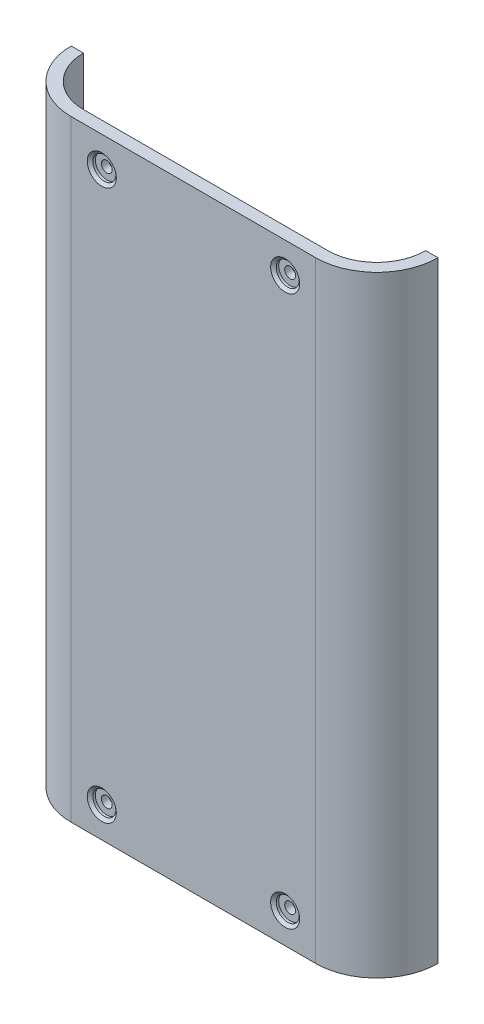
ISO-10303-21;
HEADER;
FILE_DESCRIPTION(('STEP AP214'),'2;1');
FILE_NAME('part.step','',(''),(''),'','','');
FILE_SCHEMA(('AUTOMOTIVE_DESIGN { 1 0 10303 214 1 1 1 1 }'));
ENDSEC;
DATA;
#1=APPLICATION_CONTEXT('core data for automotive mechanical design processes');
#2=APPLICATION_PROTOCOL_DEFINITION('international standard','automotive_design',2000,#1);
#3=PRODUCT_CONTEXT('',#1,'mechanical');
#4=PRODUCT('Part','Part','',(#3));
#5=PRODUCT_RELATED_PRODUCT_CATEGORY('part','',(#4));
#6=PRODUCT_DEFINITION_FORMATION('','',#4);
#7=PRODUCT_DEFINITION_CONTEXT('part definition',#1,'design');
#8=PRODUCT_DEFINITION('design','',#6,#7);
#9=PRODUCT_DEFINITION_SHAPE('','',#8);
#10=(LENGTH_UNIT() NAMED_UNIT(*) SI_UNIT(.MILLI.,.METRE.));
#11=(NAMED_UNIT(*) PLANE_ANGLE_UNIT() SI_UNIT($,.RADIAN.));
#12=(NAMED_UNIT(*) SI_UNIT($,.STERADIAN.) SOLID_ANGLE_UNIT());
#13=UNCERTAINTY_MEASURE_WITH_UNIT(LENGTH_MEASURE(1.E-05),#10,'distance_accuracy_value','');
#14=(GEOMETRIC_REPRESENTATION_CONTEXT(3) GLOBAL_UNCERTAINTY_ASSIGNED_CONTEXT((#13)) GLOBAL_UNIT_ASSIGNED_CONTEXT((#10,
#11,#12)) REPRESENTATION_CONTEXT('',''));
#15=CARTESIAN_POINT('',(0.,0.,0.));
#16=DIRECTION('',(0.,0.,1.));
#17=DIRECTION('',(1.,0.,0.));
#18=AXIS2_PLACEMENT_3D('',#15,#16,#17);
#19=CARTESIAN_POINT('',(0.,254.,25.3999999999999));
#20=DIRECTION('',(0.,0.,-1.));
#21=DIRECTION('',(-1.,0.,0.));
#22=AXIS2_PLACEMENT_3D('',#19,#20,#21);
#23=PLANE('',#22);
#24=DIRECTION('',(0.,-1.,0.));
#25=VECTOR('',#24,1.);
#26=CARTESIAN_POINT('',(-35.56,114.3,25.3999999999999));
#27=LINE('',#26,#25);
#28=CARTESIAN_POINT('',(-35.56,127.,25.3999999999999));
#29=VERTEX_POINT('',#28);
#30=CARTESIAN_POINT('',(-35.56,0.,25.3999999999999));
#31=VERTEX_POINT('',#30);
#32=EDGE_CURVE('E203',#29,#31,#27,.T.);
#33=ORIENTED_EDGE('',*,*,#32,.T.);
#34=DIRECTION('',(1.,0.,0.));
#35=VECTOR('',#34,1.);
#36=CARTESIAN_POINT('',(0.,0.,25.3999999999999));
#37=LINE('',#36,#35);
#38=CARTESIAN_POINT('',(-38.1,0.,25.4));
#39=VERTEX_POINT('',#38);
#40=EDGE_CURVE('E228',#39,#31,#37,.T.);
#41=ORIENTED_EDGE('',*,*,#40,.F.);
#42=DIRECTION('',(0.,-1.,0.));
#43=VECTOR('',#42,1.);
#44=CARTESIAN_POINT('',(-38.1,127.,25.4));
#45=LINE('',#44,#43);
#46=CARTESIAN_POINT('',(-38.1,127.,25.3999999999999));
#47=VERTEX_POINT('',#46);
#48=EDGE_CURVE('E12',#39,#47,#45,.F.);
#49=ORIENTED_EDGE('',*,*,#48,.T.);
#50=DIRECTION('',(-1.,0.,0.));
#51=VECTOR('',#50,1.);
#52=CARTESIAN_POINT('',(0.,127.,25.3999999999999));
#53=LINE('',#52,#51);
#54=EDGE_CURVE('E222',#29,#47,#53,.T.);
#55=ORIENTED_EDGE('',*,*,#54,.F.);
#56=EDGE_LOOP('',(#33,#41,#49,#55));
#57=FACE_BOUND('',#56,.T.);
#58=ADVANCED_FACE('F123',(#57),#23,.T.);
#59=CARTESIAN_POINT('',(25.4,114.3,25.4));
#60=DIRECTION('',(0.,-1.,0.));
#61=DIRECTION('',(0.,0.,-1.));
#62=AXIS2_PLACEMENT_3D('',#59,#60,#61);
#63=CYLINDRICAL_SURFACE('',#62,10.16);
#64=DIRECTION('',(0.,-1.,0.));
#65=VECTOR('',#64,1.);
#66=CARTESIAN_POINT('',(35.56,114.3,25.4));
#67=LINE('',#66,#65);
#68=CARTESIAN_POINT('',(35.56,127.,25.4));
#69=VERTEX_POINT('',#68);
#70=CARTESIAN_POINT('',(35.56,0.,25.4));
#71=VERTEX_POINT('',#70);
#72=EDGE_CURVE('E191',#69,#71,#67,.T.);
#73=ORIENTED_EDGE('',*,*,#72,.T.);
#74=CARTESIAN_POINT('',(25.4,0.,25.4));
#75=DIRECTION('',(0.,-1.,0.));
#76=DIRECTION('',(0.,0.,-1.));
#77=AXIS2_PLACEMENT_3D('',#74,#75,#76);
#78=CIRCLE('',#77,10.16);
#79=CARTESIAN_POINT('',(25.4,0.,35.56));
#80=VERTEX_POINT('',#79);
#81=EDGE_CURVE('E258',#71,#80,#78,.T.);
#82=ORIENTED_EDGE('',*,*,#81,.T.);
#83=DIRECTION('',(0.,-1.,0.));
#84=VECTOR('',#83,1.);
#85=CARTESIAN_POINT('',(25.4,124.46,35.56));
#86=LINE('',#85,#84);
#87=CARTESIAN_POINT('',(25.4,127.,35.56));
#88=VERTEX_POINT('',#87);
#89=EDGE_CURVE('E209',#88,#80,#86,.T.);
#90=ORIENTED_EDGE('',*,*,#89,.F.);
#91=CARTESIAN_POINT('',(25.4,127.,25.4));
#92=DIRECTION('',(0.,-1.,0.));
#93=DIRECTION('',(0.,0.,-1.));
#94=AXIS2_PLACEMENT_3D('',#91,#92,#93);
#95=CIRCLE('',#94,10.16);
#96=EDGE_CURVE('E207',#69,#88,#95,.T.);
#97=ORIENTED_EDGE('',*,*,#96,.F.);
#98=EDGE_LOOP('',(#73,#82,#90,#97));
#99=FACE_BOUND('',#98,.T.);
#100=ADVANCED_FACE('F208',(#99),#63,.F.);
#101=CARTESIAN_POINT('',(-25.4,114.3,25.4));
#102=DIRECTION('',(0.,-1.,0.));
#103=DIRECTION('',(0.,0.,-1.));
#104=AXIS2_PLACEMENT_3D('',#101,#102,#103);
#105=CYLINDRICAL_SURFACE('',#104,10.16);
#106=DIRECTION('',(0.,-1.,0.));
#107=VECTOR('',#106,1.);
#108=CARTESIAN_POINT('',(-25.4,124.46,35.56));
#109=LINE('',#108,#107);
#110=CARTESIAN_POINT('',(-25.4,127.,35.56));
#111=VERTEX_POINT('',#110);
#112=CARTESIAN_POINT('',(-25.4,0.,35.56));
#113=VERTEX_POINT('',#112);
#114=EDGE_CURVE('E327',#111,#113,#109,.T.);
#115=ORIENTED_EDGE('',*,*,#114,.T.);
#116=CARTESIAN_POINT('',(-25.4,0.,25.4));
#117=DIRECTION('',(0.,-1.,0.));
#118=DIRECTION('',(0.,0.,-1.));
#119=AXIS2_PLACEMENT_3D('',#116,#117,#118);
#120=CIRCLE('',#119,10.16);
#121=EDGE_CURVE('E214',#113,#31,#120,.T.);
#122=ORIENTED_EDGE('',*,*,#121,.T.);
#123=ORIENTED_EDGE('',*,*,#32,.F.);
#124=CARTESIAN_POINT('',(-25.4,127.,25.4));
#125=DIRECTION('',(0.,-1.,0.));
#126=DIRECTION('',(0.,0.,-1.));
#127=AXIS2_PLACEMENT_3D('',#124,#125,#126);
#128=CIRCLE('',#127,10.16);
#129=EDGE_CURVE('E204',#111,#29,#128,.T.);
#130=ORIENTED_EDGE('',*,*,#129,.F.);
#131=EDGE_LOOP('',(#115,#122,#123,#130));
#132=FACE_BOUND('',#131,.T.);
#133=ADVANCED_FACE('F338',(#132),#105,.F.);
#134=CARTESIAN_POINT('',(0.,127.,0.));
#135=DIRECTION('',(0.,1.,0.));
#136=DIRECTION('',(0.,0.,1.));
#137=AXIS2_PLACEMENT_3D('',#134,#135,#136);
#138=PLANE('',#137);
#139=ORIENTED_EDGE('',*,*,#129,.T.);
#140=ORIENTED_EDGE('',*,*,#54,.T.);
#141=CARTESIAN_POINT('',(-25.4,127.,25.4));
#142=DIRECTION('',(0.,1.,0.));
#143=DIRECTION('',(0.,0.,1.));
#144=AXIS2_PLACEMENT_3D('',#141,#142,#143);
#145=CIRCLE('',#144,12.7);
#146=CARTESIAN_POINT('',(-25.4,127.,38.1));
#147=VERTEX_POINT('',#146);
#148=EDGE_CURVE('E148',#47,#147,#145,.T.);
#149=ORIENTED_EDGE('',*,*,#148,.T.);
#150=DIRECTION('',(1.,0.,0.));
#151=VECTOR('',#150,1.);
#152=CARTESIAN_POINT('',(-38.1,127.,38.1));
#153=LINE('',#152,#151);
#154=CARTESIAN_POINT('',(25.4,127.,38.1));
#155=VERTEX_POINT('',#154);
#156=EDGE_CURVE('E226',#147,#155,#153,.T.);
#157=ORIENTED_EDGE('',*,*,#156,.T.);
#158=CARTESIAN_POINT('',(25.4,127.,25.4));
#159=DIRECTION('',(0.,1.,0.));
#160=DIRECTION('',(0.,0.,1.));
#161=AXIS2_PLACEMENT_3D('',#158,#159,#160);
#162=CIRCLE('',#161,12.7);
#163=CARTESIAN_POINT('',(38.1,127.,25.4));
#164=VERTEX_POINT('',#163);
#165=EDGE_CURVE('E133',#155,#164,#162,.T.);
#166=ORIENTED_EDGE('',*,*,#165,.T.);
#167=EDGE_CURVE('E196',#164,#69,#53,.T.);
#168=ORIENTED_EDGE('',*,*,#167,.T.);
#169=ORIENTED_EDGE('',*,*,#96,.T.);
#170=DIRECTION('',(1.,0.,0.));
#171=VECTOR('',#170,1.);
#172=CARTESIAN_POINT('',(0.,127.,35.56));
#173=LINE('',#172,#171);
#174=EDGE_CURVE('E213',#111,#88,#173,.T.);
#175=ORIENTED_EDGE('',*,*,#174,.F.);
#176=EDGE_LOOP('',(#139,#140,#149,#157,#166,#168,#169,#175));
#177=FACE_BOUND('',#176,.T.);
#178=ADVANCED_FACE('F217',(#177),#138,.T.);
#179=CARTESIAN_POINT('',(0.,0.,0.));
#180=DIRECTION('',(0.,1.,0.));
#181=DIRECTION('',(0.,0.,1.));
#182=AXIS2_PLACEMENT_3D('',#179,#180,#181);
#183=PLANE('',#182);
#184=ORIENTED_EDGE('',*,*,#40,.T.);
#185=ORIENTED_EDGE('',*,*,#121,.F.);
#186=DIRECTION('',(1.,0.,0.));
#187=VECTOR('',#186,1.);
#188=CARTESIAN_POINT('',(0.,0.,35.56));
#189=LINE('',#188,#187);
#190=EDGE_CURVE('E322',#113,#80,#189,.T.);
#191=ORIENTED_EDGE('',*,*,#190,.T.);
#192=ORIENTED_EDGE('',*,*,#81,.F.);
#193=CARTESIAN_POINT('',(38.1,0.,25.4));
#194=VERTEX_POINT('',#193);
#195=EDGE_CURVE('E198',#71,#194,#37,.T.);
#196=ORIENTED_EDGE('',*,*,#195,.T.);
#197=CARTESIAN_POINT('',(25.4,0.,25.4));
#198=DIRECTION('',(0.,1.,0.));
#199=DIRECTION('',(0.,0.,1.));
#200=AXIS2_PLACEMENT_3D('',#197,#198,#199);
#201=CIRCLE('',#200,12.7);
#202=CARTESIAN_POINT('',(25.4,0.,38.1));
#203=VERTEX_POINT('',#202);
#204=EDGE_CURVE('E241',#194,#203,#201,.F.);
#205=ORIENTED_EDGE('',*,*,#204,.T.);
#206=DIRECTION('',(1.,0.,0.));
#207=VECTOR('',#206,1.);
#208=CARTESIAN_POINT('',(-38.1,0.,38.1));
#209=LINE('',#208,#207);
#210=CARTESIAN_POINT('',(-25.4,0.,38.1));
#211=VERTEX_POINT('',#210);
#212=EDGE_CURVE('E221',#211,#203,#209,.T.);
#213=ORIENTED_EDGE('',*,*,#212,.F.);
#214=CARTESIAN_POINT('',(-25.4,0.,25.4));
#215=DIRECTION('',(0.,1.,0.));
#216=DIRECTION('',(0.,0.,1.));
#217=AXIS2_PLACEMENT_3D('',#214,#215,#216);
#218=CIRCLE('',#217,12.7);
#219=EDGE_CURVE('E237',#211,#39,#218,.F.);
#220=ORIENTED_EDGE('',*,*,#219,.T.);
#221=EDGE_LOOP('',(#184,#185,#191,#192,#196,#205,#213,#220));
#222=FACE_BOUND('',#221,.T.);
#223=ADVANCED_FACE('F336',(#222),#183,.F.);
#224=CARTESIAN_POINT('',(-38.1,127.,38.1));
#225=DIRECTION('',(0.,0.,-1.));
#226=DIRECTION('',(-1.,0.,0.));
#227=AXIS2_PLACEMENT_3D('',#224,#225,#226);
#228=PLANE('',#227);
#229=CARTESIAN_POINT('',(-19.05,120.65,38.1));
#230=DIRECTION('',(0.,0.,1.));
#231=DIRECTION('',(1.,0.,0.));
#232=AXIS2_PLACEMENT_3D('',#229,#230,#231);
#233=CIRCLE('',#232,3.01625);
#234=CARTESIAN_POINT('',(-16.03375,120.65,38.1));
#235=VERTEX_POINT('',#234);
#236=EDGE_CURVE('E448',#235,#235,#233,.T.);
#237=ORIENTED_EDGE('',*,*,#236,.F.);
#238=EDGE_LOOP('',(#237));
#239=FACE_BOUND('',#238,.T.);
#240=CARTESIAN_POINT('',(19.05,120.65,38.1));
#241=DIRECTION('',(0.,0.,1.));
#242=DIRECTION('',(1.,0.,0.));
#243=AXIS2_PLACEMENT_3D('',#240,#241,#242);
#244=CIRCLE('',#243,3.01625);
#245=CARTESIAN_POINT('',(22.06625,120.65,38.1));
#246=VERTEX_POINT('',#245);
#247=EDGE_CURVE('E462',#246,#246,#244,.T.);
#248=ORIENTED_EDGE('',*,*,#247,.F.);
#249=EDGE_LOOP('',(#248));
#250=FACE_BOUND('',#249,.T.);
#251=CARTESIAN_POINT('',(-19.05,6.35,38.1));
#252=DIRECTION('',(0.,0.,1.));
#253=DIRECTION('',(1.,0.,0.));
#254=AXIS2_PLACEMENT_3D('',#251,#252,#253);
#255=CIRCLE('',#254,3.01625);
#256=CARTESIAN_POINT('',(-16.03375,6.35,38.1));
#257=VERTEX_POINT('',#256);
#258=EDGE_CURVE('E268',#257,#257,#255,.T.);
#259=ORIENTED_EDGE('',*,*,#258,.F.);
#260=EDGE_LOOP('',(#259));
#261=FACE_BOUND('',#260,.T.);
#262=CARTESIAN_POINT('',(19.05,6.35,38.1));
#263=DIRECTION('',(0.,0.,1.));
#264=DIRECTION('',(1.,0.,0.));
#265=AXIS2_PLACEMENT_3D('',#262,#263,#264);
#266=CIRCLE('',#265,3.01625);
#267=CARTESIAN_POINT('',(22.06625,6.35,38.1));
#268=VERTEX_POINT('',#267);
#269=EDGE_CURVE('E263',#268,#268,#266,.T.);
#270=ORIENTED_EDGE('',*,*,#269,.F.);
#271=EDGE_LOOP('',(#270));
#272=FACE_BOUND('',#271,.T.);
#273=ORIENTED_EDGE('',*,*,#212,.T.);
#274=DIRECTION('',(0.,-1.,0.));
#275=VECTOR('',#274,1.);
#276=CARTESIAN_POINT('',(25.4,127.,38.1));
#277=LINE('',#276,#275);
#278=EDGE_CURVE('E141',#203,#155,#277,.F.);
#279=ORIENTED_EDGE('',*,*,#278,.T.);
#280=ORIENTED_EDGE('',*,*,#156,.F.);
#281=DIRECTION('',(0.,-1.,0.));
#282=VECTOR('',#281,1.);
#283=CARTESIAN_POINT('',(-25.4,127.,38.1));
#284=LINE('',#283,#282);
#285=EDGE_CURVE('E244',#147,#211,#284,.T.);
#286=ORIENTED_EDGE('',*,*,#285,.T.);
#287=EDGE_LOOP('',(#273,#279,#280,#286));
#288=FACE_BOUND('',#287,.T.);
#289=ADVANCED_FACE('F346',(#239,#250,#261,#272,#288),#228,.F.);
#290=CARTESIAN_POINT('',(25.4,127.,25.4));
#291=DIRECTION('',(0.,-1.,0.));
#292=DIRECTION('',(0.,0.,-1.));
#293=AXIS2_PLACEMENT_3D('',#290,#291,#292);
#294=CYLINDRICAL_SURFACE('',#293,12.7);
#295=ORIENTED_EDGE('',*,*,#165,.F.);
#296=ORIENTED_EDGE('',*,*,#278,.F.);
#297=ORIENTED_EDGE('',*,*,#204,.F.);
#298=DIRECTION('',(0.,-1.,0.));
#299=VECTOR('',#298,1.);
#300=CARTESIAN_POINT('',(38.1,127.,25.4));
#301=LINE('',#300,#299);
#302=EDGE_CURVE('E233',#164,#194,#301,.T.);
#303=ORIENTED_EDGE('',*,*,#302,.F.);
#304=EDGE_LOOP('',(#295,#296,#297,#303));
#305=FACE_BOUND('',#304,.T.);
#306=ADVANCED_FACE('F349',(#305),#294,.T.);
#307=CARTESIAN_POINT('',(-25.4,127.,25.4));
#308=DIRECTION('',(0.,-1.,0.));
#309=DIRECTION('',(0.,0.,-1.));
#310=AXIS2_PLACEMENT_3D('',#307,#308,#309);
#311=CYLINDRICAL_SURFACE('',#310,12.7);
#312=ORIENTED_EDGE('',*,*,#148,.F.);
#313=ORIENTED_EDGE('',*,*,#48,.F.);
#314=ORIENTED_EDGE('',*,*,#219,.F.);
#315=ORIENTED_EDGE('',*,*,#285,.F.);
#316=EDGE_LOOP('',(#312,#313,#314,#315));
#317=FACE_BOUND('',#316,.T.);
#318=ADVANCED_FACE('F125',(#317),#311,.T.);
#319=ORIENTED_EDGE('',*,*,#72,.F.);
#320=ORIENTED_EDGE('',*,*,#167,.F.);
#321=ORIENTED_EDGE('',*,*,#302,.T.);
#322=ORIENTED_EDGE('',*,*,#195,.F.);
#323=EDGE_LOOP('',(#319,#320,#321,#322));
#324=FACE_BOUND('',#323,.T.);
#325=ADVANCED_FACE('F193',(#324),#23,.T.);
#326=CARTESIAN_POINT('',(0.,124.46,35.56));
#327=DIRECTION('',(0.,0.,-1.));
#328=DIRECTION('',(-1.,0.,0.));
#329=AXIS2_PLACEMENT_3D('',#326,#327,#328);
#330=PLANE('',#329);
#331=CARTESIAN_POINT('',(-19.05,120.65,35.56));
#332=DIRECTION('',(0.,0.,-1.));
#333=DIRECTION('',(-1.,0.,0.));
#334=AXIS2_PLACEMENT_3D('',#331,#332,#333);
#335=CIRCLE('',#334,1.1303);
#336=CARTESIAN_POINT('',(-20.1803,120.65,35.56));
#337=VERTEX_POINT('',#336);
#338=EDGE_CURVE('E127',#337,#337,#335,.T.);
#339=ORIENTED_EDGE('',*,*,#338,.F.);
#340=EDGE_LOOP('',(#339));
#341=FACE_BOUND('',#340,.T.);
#342=CARTESIAN_POINT('',(19.05,120.65,35.56));
#343=DIRECTION('',(0.,0.,-1.));
#344=DIRECTION('',(-1.,0.,0.));
#345=AXIS2_PLACEMENT_3D('',#342,#343,#344);
#346=CIRCLE('',#345,1.1303);
#347=CARTESIAN_POINT('',(17.9197,120.65,35.56));
#348=VERTEX_POINT('',#347);
#349=EDGE_CURVE('E265',#348,#348,#346,.T.);
#350=ORIENTED_EDGE('',*,*,#349,.F.);
#351=EDGE_LOOP('',(#350));
#352=FACE_BOUND('',#351,.T.);
#353=CARTESIAN_POINT('',(-19.05,6.35,35.56));
#354=DIRECTION('',(0.,0.,-1.));
#355=DIRECTION('',(-1.,0.,0.));
#356=AXIS2_PLACEMENT_3D('',#353,#354,#355);
#357=CIRCLE('',#356,1.1303);
#358=CARTESIAN_POINT('',(-20.1803,6.35,35.56));
#359=VERTEX_POINT('',#358);
#360=EDGE_CURVE('E260',#359,#359,#357,.T.);
#361=ORIENTED_EDGE('',*,*,#360,.F.);
#362=EDGE_LOOP('',(#361));
#363=FACE_BOUND('',#362,.T.);
#364=CARTESIAN_POINT('',(19.05,6.35,35.56));
#365=DIRECTION('',(0.,0.,-1.));
#366=DIRECTION('',(-1.,0.,0.));
#367=AXIS2_PLACEMENT_3D('',#364,#365,#366);
#368=CIRCLE('',#367,1.1303);
#369=CARTESIAN_POINT('',(17.9197,6.35,35.56));
#370=VERTEX_POINT('',#369);
#371=EDGE_CURVE('E254',#370,#370,#368,.T.);
#372=ORIENTED_EDGE('',*,*,#371,.F.);
#373=EDGE_LOOP('',(#372));
#374=FACE_BOUND('',#373,.T.);
#375=ORIENTED_EDGE('',*,*,#190,.F.);
#376=ORIENTED_EDGE('',*,*,#114,.F.);
#377=ORIENTED_EDGE('',*,*,#174,.T.);
#378=ORIENTED_EDGE('',*,*,#89,.T.);
#379=EDGE_LOOP('',(#375,#376,#377,#378));
#380=FACE_BOUND('',#379,.T.);
#381=ADVANCED_FACE('F332',(#341,#352,#363,#374,#380),#330,.T.);
#382=CARTESIAN_POINT('',(19.05,6.35,38.1));
#383=DIRECTION('',(0.,0.,1.));
#384=DIRECTION('',(1.,0.,0.));
#385=AXIS2_PLACEMENT_3D('',#382,#383,#384);
#386=CYLINDRICAL_SURFACE('',#385,1.1303);
#387=ORIENTED_EDGE('',*,*,#371,.T.);
#388=EDGE_LOOP('',(#387));
#389=FACE_BOUND('',#388,.T.);
#390=CARTESIAN_POINT('',(19.05,6.35,37.0586));
#391=DIRECTION('',(0.,0.,1.));
#392=DIRECTION('',(1.,0.,0.));
#393=AXIS2_PLACEMENT_3D('',#390,#391,#392);
#394=CIRCLE('',#393,1.1303);
#395=CARTESIAN_POINT('',(20.1803,6.35,37.0586));
#396=VERTEX_POINT('',#395);
#397=EDGE_CURVE('E259',#396,#396,#394,.T.);
#398=ORIENTED_EDGE('',*,*,#397,.T.);
#399=EDGE_LOOP('',(#398));
#400=FACE_BOUND('',#399,.T.);
#401=ADVANCED_FACE('F370',(#389,#400),#386,.F.);
#402=CARTESIAN_POINT('',(20.1803,6.35,37.0586));
#403=DIRECTION('',(0.,0.,-1.));
#404=DIRECTION('',(-1.,0.,0.));
#405=AXIS2_PLACEMENT_3D('',#402,#403,#404);
#406=PLANE('',#405);
#407=ORIENTED_EDGE('',*,*,#397,.F.);
#408=EDGE_LOOP('',(#407));
#409=FACE_BOUND('',#408,.T.);
#410=CARTESIAN_POINT('',(19.05,6.35,37.0586));
#411=DIRECTION('',(0.,0.,1.));
#412=DIRECTION('',(1.,0.,0.));
#413=AXIS2_PLACEMENT_3D('',#410,#411,#412);
#414=CIRCLE('',#413,2.38125);
#415=CARTESIAN_POINT('',(21.43125,6.35,37.0586));
#416=VERTEX_POINT('',#415);
#417=EDGE_CURVE('E305',#416,#416,#414,.T.);
#418=ORIENTED_EDGE('',*,*,#417,.T.);
#419=EDGE_LOOP('',(#418));
#420=FACE_BOUND('',#419,.T.);
#421=ADVANCED_FACE('F375',(#409,#420),#406,.F.);
#422=CARTESIAN_POINT('',(19.05,6.35,38.1));
#423=DIRECTION('',(0.,0.,1.));
#424=DIRECTION('',(1.,0.,0.));
#425=AXIS2_PLACEMENT_3D('',#422,#423,#424);
#426=CYLINDRICAL_SURFACE('',#425,2.38125);
#427=ORIENTED_EDGE('',*,*,#417,.F.);
#428=EDGE_LOOP('',(#427));
#429=FACE_BOUND('',#428,.T.);
#430=CARTESIAN_POINT('',(19.05,6.35,37.5671717342024));
#431=DIRECTION('',(0.,0.,1.));
#432=DIRECTION('',(1.,0.,0.));
#433=AXIS2_PLACEMENT_3D('',#430,#431,#432);
#434=CIRCLE('',#433,2.38125);
#435=CARTESIAN_POINT('',(21.43125,6.35,37.5671717342024));
#436=VERTEX_POINT('',#435);
#437=EDGE_CURVE('E301',#436,#436,#434,.T.);
#438=ORIENTED_EDGE('',*,*,#437,.T.);
#439=EDGE_LOOP('',(#438));
#440=FACE_BOUND('',#439,.T.);
#441=ADVANCED_FACE('F385',(#429,#440),#426,.F.);
#442=CARTESIAN_POINT('',(19.05,6.35,38.1));
#443=DIRECTION('',(0.,0.,1.));
#444=DIRECTION('',(1.,0.,0.));
#445=AXIS2_PLACEMENT_3D('',#442,#443,#444);
#446=CONICAL_SURFACE('',#445,3.01625,0.872664625997164);
#447=ORIENTED_EDGE('',*,*,#437,.F.);
#448=EDGE_LOOP('',(#447));
#449=FACE_BOUND('',#448,.T.);
#450=ORIENTED_EDGE('',*,*,#269,.T.);
#451=EDGE_LOOP('',(#450));
#452=FACE_BOUND('',#451,.T.);
#453=ADVANCED_FACE('F389',(#449,#452),#446,.F.);
#454=CARTESIAN_POINT('',(-19.05,6.35,38.1));
#455=DIRECTION('',(0.,0.,1.));
#456=DIRECTION('',(1.,0.,0.));
#457=AXIS2_PLACEMENT_3D('',#454,#455,#456);
#458=CYLINDRICAL_SURFACE('',#457,1.1303);
#459=ORIENTED_EDGE('',*,*,#360,.T.);
#460=EDGE_LOOP('',(#459));
#461=FACE_BOUND('',#460,.T.);
#462=CARTESIAN_POINT('',(-19.05,6.35,37.0586));
#463=DIRECTION('',(0.,0.,1.));
#464=DIRECTION('',(1.,0.,0.));
#465=AXIS2_PLACEMENT_3D('',#462,#463,#464);
#466=CIRCLE('',#465,1.1303);
#467=CARTESIAN_POINT('',(-17.9197,6.35,37.0586));
#468=VERTEX_POINT('',#467);
#469=EDGE_CURVE('E264',#468,#468,#466,.T.);
#470=ORIENTED_EDGE('',*,*,#469,.T.);
#471=EDGE_LOOP('',(#470));
#472=FACE_BOUND('',#471,.T.);
#473=ADVANCED_FACE('F393',(#461,#472),#458,.F.);
#474=CARTESIAN_POINT('',(-17.9197,6.35,37.0586));
#475=DIRECTION('',(0.,0.,-1.));
#476=DIRECTION('',(-1.,0.,0.));
#477=AXIS2_PLACEMENT_3D('',#474,#475,#476);
#478=PLANE('',#477);
#479=ORIENTED_EDGE('',*,*,#469,.F.);
#480=EDGE_LOOP('',(#479));
#481=FACE_BOUND('',#480,.T.);
#482=CARTESIAN_POINT('',(-19.05,6.35,37.0586));
#483=DIRECTION('',(0.,0.,1.));
#484=DIRECTION('',(1.,0.,0.));
#485=AXIS2_PLACEMENT_3D('',#482,#483,#484);
#486=CIRCLE('',#485,2.38125);
#487=CARTESIAN_POINT('',(-16.66875,6.35,37.0586));
#488=VERTEX_POINT('',#487);
#489=EDGE_CURVE('E291',#488,#488,#486,.T.);
#490=ORIENTED_EDGE('',*,*,#489,.T.);
#491=EDGE_LOOP('',(#490));
#492=FACE_BOUND('',#491,.T.);
#493=ADVANCED_FACE('F397',(#481,#492),#478,.F.);
#494=CARTESIAN_POINT('',(-19.05,6.35,38.1));
#495=DIRECTION('',(0.,0.,1.));
#496=DIRECTION('',(1.,0.,0.));
#497=AXIS2_PLACEMENT_3D('',#494,#495,#496);
#498=CYLINDRICAL_SURFACE('',#497,2.38125);
#499=ORIENTED_EDGE('',*,*,#489,.F.);
#500=EDGE_LOOP('',(#499));
#501=FACE_BOUND('',#500,.T.);
#502=CARTESIAN_POINT('',(-19.05,6.35,37.5671717342024));
#503=DIRECTION('',(0.,0.,1.));
#504=DIRECTION('',(1.,0.,0.));
#505=AXIS2_PLACEMENT_3D('',#502,#503,#504);
#506=CIRCLE('',#505,2.38125);
#507=CARTESIAN_POINT('',(-16.66875,6.35,37.5671717342024));
#508=VERTEX_POINT('',#507);
#509=EDGE_CURVE('E275',#508,#508,#506,.T.);
#510=ORIENTED_EDGE('',*,*,#509,.T.);
#511=EDGE_LOOP('',(#510));
#512=FACE_BOUND('',#511,.T.);
#513=ADVANCED_FACE('F401',(#501,#512),#498,.F.);
#514=CARTESIAN_POINT('',(-19.05,6.35,38.1));
#515=DIRECTION('',(0.,0.,1.));
#516=DIRECTION('',(1.,0.,0.));
#517=AXIS2_PLACEMENT_3D('',#514,#515,#516);
#518=CONICAL_SURFACE('',#517,3.01625,0.872664625997164);
#519=ORIENTED_EDGE('',*,*,#509,.F.);
#520=EDGE_LOOP('',(#519));
#521=FACE_BOUND('',#520,.T.);
#522=ORIENTED_EDGE('',*,*,#258,.T.);
#523=EDGE_LOOP('',(#522));
#524=FACE_BOUND('',#523,.T.);
#525=ADVANCED_FACE('F405',(#521,#524),#518,.F.);
#526=CARTESIAN_POINT('',(19.05,120.65,38.1));
#527=DIRECTION('',(0.,0.,1.));
#528=DIRECTION('',(1.,0.,0.));
#529=AXIS2_PLACEMENT_3D('',#526,#527,#528);
#530=CYLINDRICAL_SURFACE('',#529,1.1303);
#531=ORIENTED_EDGE('',*,*,#349,.T.);
#532=EDGE_LOOP('',(#531));
#533=FACE_BOUND('',#532,.T.);
#534=CARTESIAN_POINT('',(19.05,120.65,37.0586));
#535=DIRECTION('',(0.,0.,1.));
#536=DIRECTION('',(1.,0.,0.));
#537=AXIS2_PLACEMENT_3D('',#534,#535,#536);
#538=CIRCLE('',#537,1.1303);
#539=CARTESIAN_POINT('',(20.1803,120.65,37.0586));
#540=VERTEX_POINT('',#539);
#541=EDGE_CURVE('E269',#540,#540,#538,.T.);
#542=ORIENTED_EDGE('',*,*,#541,.T.);
#543=EDGE_LOOP('',(#542));
#544=FACE_BOUND('',#543,.T.);
#545=ADVANCED_FACE('F409',(#533,#544),#530,.F.);
#546=CARTESIAN_POINT('',(20.1803,120.65,37.0586));
#547=DIRECTION('',(0.,0.,-1.));
#548=DIRECTION('',(-1.,0.,0.));
#549=AXIS2_PLACEMENT_3D('',#546,#547,#548);
#550=PLANE('',#549);
#551=ORIENTED_EDGE('',*,*,#541,.F.);
#552=EDGE_LOOP('',(#551));
#553=FACE_BOUND('',#552,.T.);
#554=CARTESIAN_POINT('',(19.05,120.65,37.0586));
#555=DIRECTION('',(0.,0.,1.));
#556=DIRECTION('',(1.,0.,0.));
#557=AXIS2_PLACEMENT_3D('',#554,#555,#556);
#558=CIRCLE('',#557,2.38125);
#559=CARTESIAN_POINT('',(21.43125,120.65,37.0586));
#560=VERTEX_POINT('',#559);
#561=EDGE_CURVE('E278',#560,#560,#558,.T.);
#562=ORIENTED_EDGE('',*,*,#561,.T.);
#563=EDGE_LOOP('',(#562));
#564=FACE_BOUND('',#563,.T.);
#565=ADVANCED_FACE('F413',(#553,#564),#550,.F.);
#566=CARTESIAN_POINT('',(19.05,120.65,38.1));
#567=DIRECTION('',(0.,0.,1.));
#568=DIRECTION('',(1.,0.,0.));
#569=AXIS2_PLACEMENT_3D('',#566,#567,#568);
#570=CYLINDRICAL_SURFACE('',#569,2.38125);
#571=ORIENTED_EDGE('',*,*,#561,.F.);
#572=EDGE_LOOP('',(#571));
#573=FACE_BOUND('',#572,.T.);
#574=CARTESIAN_POINT('',(19.05,120.65,37.5671717342024));
#575=DIRECTION('',(0.,0.,1.));
#576=DIRECTION('',(1.,0.,0.));
#577=AXIS2_PLACEMENT_3D('',#574,#575,#576);
#578=CIRCLE('',#577,2.38125);
#579=CARTESIAN_POINT('',(21.43125,120.65,37.5671717342024));
#580=VERTEX_POINT('',#579);
#581=EDGE_CURVE('E284',#580,#580,#578,.T.);
#582=ORIENTED_EDGE('',*,*,#581,.T.);
#583=EDGE_LOOP('',(#582));
#584=FACE_BOUND('',#583,.T.);
#585=ADVANCED_FACE('F416',(#573,#584),#570,.F.);
#586=CARTESIAN_POINT('',(19.05,120.65,38.1));
#587=DIRECTION('',(0.,0.,1.));
#588=DIRECTION('',(1.,0.,0.));
#589=AXIS2_PLACEMENT_3D('',#586,#587,#588);
#590=CONICAL_SURFACE('',#589,3.01625,0.872664625997164);
#591=ORIENTED_EDGE('',*,*,#581,.F.);
#592=EDGE_LOOP('',(#591));
#593=FACE_BOUND('',#592,.T.);
#594=ORIENTED_EDGE('',*,*,#247,.T.);
#595=EDGE_LOOP('',(#594));
#596=FACE_BOUND('',#595,.T.);
#597=ADVANCED_FACE('F420',(#593,#596),#590,.F.);
#598=CARTESIAN_POINT('',(-19.05,120.65,38.1));
#599=DIRECTION('',(0.,0.,1.));
#600=DIRECTION('',(1.,0.,0.));
#601=AXIS2_PLACEMENT_3D('',#598,#599,#600);
#602=CYLINDRICAL_SURFACE('',#601,1.1303);
#603=ORIENTED_EDGE('',*,*,#338,.T.);
#604=EDGE_LOOP('',(#603));
#605=FACE_BOUND('',#604,.T.);
#606=CARTESIAN_POINT('',(-19.05,120.65,37.0586));
#607=DIRECTION('',(0.,0.,1.));
#608=DIRECTION('',(1.,0.,0.));
#609=AXIS2_PLACEMENT_3D('',#606,#607,#608);
#610=CIRCLE('',#609,1.1303);
#611=CARTESIAN_POINT('',(-17.9197,120.65,37.0586));
#612=VERTEX_POINT('',#611);
#613=EDGE_CURVE('E458',#612,#612,#610,.T.);
#614=ORIENTED_EDGE('',*,*,#613,.T.);
#615=EDGE_LOOP('',(#614));
#616=FACE_BOUND('',#615,.T.);
#617=ADVANCED_FACE('F424',(#605,#616),#602,.F.);
#618=CARTESIAN_POINT('',(-17.9197,120.65,37.0586));
#619=DIRECTION('',(0.,0.,-1.));
#620=DIRECTION('',(-1.,0.,0.));
#621=AXIS2_PLACEMENT_3D('',#618,#619,#620);
#622=PLANE('',#621);
#623=ORIENTED_EDGE('',*,*,#613,.F.);
#624=EDGE_LOOP('',(#623));
#625=FACE_BOUND('',#624,.T.);
#626=CARTESIAN_POINT('',(-19.05,120.65,37.0586));
#627=DIRECTION('',(0.,0.,1.));
#628=DIRECTION('',(1.,0.,0.));
#629=AXIS2_PLACEMENT_3D('',#626,#627,#628);
#630=CIRCLE('',#629,2.38125);
#631=CARTESIAN_POINT('',(-16.66875,120.65,37.0586));
#632=VERTEX_POINT('',#631);
#633=EDGE_CURVE('E452',#632,#632,#630,.T.);
#634=ORIENTED_EDGE('',*,*,#633,.T.);
#635=EDGE_LOOP('',(#634));
#636=FACE_BOUND('',#635,.T.);
#637=ADVANCED_FACE('F428',(#625,#636),#622,.F.);
#638=CARTESIAN_POINT('',(-19.05,120.65,38.1));
#639=DIRECTION('',(0.,0.,1.));
#640=DIRECTION('',(1.,0.,0.));
#641=AXIS2_PLACEMENT_3D('',#638,#639,#640);
#642=CYLINDRICAL_SURFACE('',#641,2.38125);
#643=ORIENTED_EDGE('',*,*,#633,.F.);
#644=EDGE_LOOP('',(#643));
#645=FACE_BOUND('',#644,.T.);
#646=CARTESIAN_POINT('',(-19.05,120.65,37.5671717342024));
#647=DIRECTION('',(0.,0.,1.));
#648=DIRECTION('',(1.,0.,0.));
#649=AXIS2_PLACEMENT_3D('',#646,#647,#648);
#650=CIRCLE('',#649,2.38125);
#651=CARTESIAN_POINT('',(-16.66875,120.65,37.5671717342024));
#652=VERTEX_POINT('',#651);
#653=EDGE_CURVE('E445',#652,#652,#650,.T.);
#654=ORIENTED_EDGE('',*,*,#653,.T.);
#655=EDGE_LOOP('',(#654));
#656=FACE_BOUND('',#655,.T.);
#657=ADVANCED_FACE('F432',(#645,#656),#642,.F.);
#658=CARTESIAN_POINT('',(-19.05,120.65,38.1));
#659=DIRECTION('',(0.,0.,1.));
#660=DIRECTION('',(1.,0.,0.));
#661=AXIS2_PLACEMENT_3D('',#658,#659,#660);
#662=CONICAL_SURFACE('',#661,3.01625,0.872664625997164);
#663=ORIENTED_EDGE('',*,*,#653,.F.);
#664=EDGE_LOOP('',(#663));
#665=FACE_BOUND('',#664,.T.);
#666=ORIENTED_EDGE('',*,*,#236,.T.);
#667=EDGE_LOOP('',(#666));
#668=FACE_BOUND('',#667,.T.);
#669=ADVANCED_FACE('F436',(#665,#668),#662,.F.);
#670=CLOSED_SHELL('',(#58,#100,#133,#178,#223,#289,#306,#318,#325,#381,#401,#421,#441,#453,#473,
#493,#513,#525,#545,#565,#585,#597,#617,#637,#657,#669));
#671=MANIFOLD_SOLID_BREP('B2',#670);
#672=ADVANCED_BREP_SHAPE_REPRESENTATION('',(#18,#671),#14);
#673=SHAPE_DEFINITION_REPRESENTATION(#9,#672);
ENDSEC;
END-ISO-10303-21;
